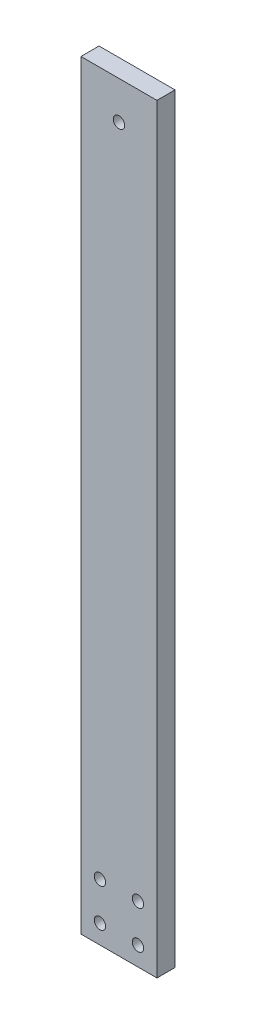
ISO-10303-21;
HEADER;
FILE_DESCRIPTION(('STEP AP214'),'2;1');
FILE_NAME('part.step','',(''),(''),'','','');
FILE_SCHEMA(('AUTOMOTIVE_DESIGN { 1 0 10303 214 1 1 1 1 }'));
ENDSEC;
DATA;
#1=APPLICATION_CONTEXT('core data for automotive mechanical design processes');
#2=APPLICATION_PROTOCOL_DEFINITION('international standard','automotive_design',2000,#1);
#3=PRODUCT_CONTEXT('',#1,'mechanical');
#4=PRODUCT('Part','Part','',(#3));
#5=PRODUCT_RELATED_PRODUCT_CATEGORY('part','',(#4));
#6=PRODUCT_DEFINITION_FORMATION('','',#4);
#7=PRODUCT_DEFINITION_CONTEXT('part definition',#1,'design');
#8=PRODUCT_DEFINITION('design','',#6,#7);
#9=PRODUCT_DEFINITION_SHAPE('','',#8);
#10=(LENGTH_UNIT() NAMED_UNIT(*) SI_UNIT(.MILLI.,.METRE.));
#11=(NAMED_UNIT(*) PLANE_ANGLE_UNIT() SI_UNIT($,.RADIAN.));
#12=(NAMED_UNIT(*) SI_UNIT($,.STERADIAN.) SOLID_ANGLE_UNIT());
#13=UNCERTAINTY_MEASURE_WITH_UNIT(LENGTH_MEASURE(1.E-05),#10,'distance_accuracy_value','');
#14=(GEOMETRIC_REPRESENTATION_CONTEXT(3) GLOBAL_UNCERTAINTY_ASSIGNED_CONTEXT((#13)) GLOBAL_UNIT_ASSIGNED_CONTEXT((#10,
#11,#12)) REPRESENTATION_CONTEXT('',''));
#15=CARTESIAN_POINT('',(0.,0.,0.));
#16=DIRECTION('',(0.,0.,1.));
#17=DIRECTION('',(1.,0.,0.));
#18=AXIS2_PLACEMENT_3D('',#15,#16,#17);
#19=CARTESIAN_POINT('',(10.,-100.,4.7625));
#20=DIRECTION('',(-1.,0.,0.));
#21=DIRECTION('',(0.,0.,1.));
#22=AXIS2_PLACEMENT_3D('',#19,#20,#21);
#23=PLANE('',#22);
#24=DIRECTION('',(0.,1.,0.));
#25=VECTOR('',#24,1.);
#26=CARTESIAN_POINT('',(10.,-100.,0.));
#27=LINE('',#26,#25);
#28=CARTESIAN_POINT('',(10.,-100.,0.));
#29=VERTEX_POINT('',#28);
#30=CARTESIAN_POINT('',(10.,100.,0.));
#31=VERTEX_POINT('',#30);
#32=EDGE_CURVE('E97',#29,#31,#27,.T.);
#33=ORIENTED_EDGE('',*,*,#32,.T.);
#34=DIRECTION('',(0.,0.,-1.));
#35=VECTOR('',#34,1.);
#36=CARTESIAN_POINT('',(10.,100.,4.7625));
#37=LINE('',#36,#35);
#38=CARTESIAN_POINT('',(10.,100.,4.7625));
#39=VERTEX_POINT('',#38);
#40=EDGE_CURVE('E11',#39,#31,#37,.T.);
#41=ORIENTED_EDGE('',*,*,#40,.F.);
#42=DIRECTION('',(0.,1.,0.));
#43=VECTOR('',#42,1.);
#44=CARTESIAN_POINT('',(10.,-100.,4.7625));
#45=LINE('',#44,#43);
#46=CARTESIAN_POINT('',(10.,-100.,4.7625));
#47=VERTEX_POINT('',#46);
#48=EDGE_CURVE('E85',#47,#39,#45,.T.);
#49=ORIENTED_EDGE('',*,*,#48,.F.);
#50=DIRECTION('',(0.,0.,-1.));
#51=VECTOR('',#50,1.);
#52=CARTESIAN_POINT('',(10.,-100.,4.7625));
#53=LINE('',#52,#51);
#54=EDGE_CURVE('E93',#47,#29,#53,.T.);
#55=ORIENTED_EDGE('',*,*,#54,.T.);
#56=EDGE_LOOP('',(#33,#41,#49,#55));
#57=FACE_BOUND('',#56,.T.);
#58=ADVANCED_FACE('F34',(#57),#23,.F.);
#59=CARTESIAN_POINT('',(-10.,100.,4.7625));
#60=DIRECTION('',(0.,-1.,0.));
#61=DIRECTION('',(0.,0.,-1.));
#62=AXIS2_PLACEMENT_3D('',#59,#60,#61);
#63=PLANE('',#62);
#64=DIRECTION('',(-1.,0.,0.));
#65=VECTOR('',#64,1.);
#66=CARTESIAN_POINT('',(-10.,100.,0.));
#67=LINE('',#66,#65);
#68=CARTESIAN_POINT('',(-10.,100.,0.));
#69=VERTEX_POINT('',#68);
#70=EDGE_CURVE('E89',#31,#69,#67,.T.);
#71=ORIENTED_EDGE('',*,*,#70,.T.);
#72=DIRECTION('',(0.,0.,-1.));
#73=VECTOR('',#72,1.);
#74=CARTESIAN_POINT('',(-10.,100.,4.7625));
#75=LINE('',#74,#73);
#76=CARTESIAN_POINT('',(-10.,100.,4.7625));
#77=VERTEX_POINT('',#76);
#78=EDGE_CURVE('E42',#77,#69,#75,.T.);
#79=ORIENTED_EDGE('',*,*,#78,.F.);
#80=DIRECTION('',(-1.,0.,0.));
#81=VECTOR('',#80,1.);
#82=CARTESIAN_POINT('',(-10.,100.,4.7625));
#83=LINE('',#82,#81);
#84=EDGE_CURVE('E80',#39,#77,#83,.T.);
#85=ORIENTED_EDGE('',*,*,#84,.F.);
#86=ORIENTED_EDGE('',*,*,#40,.T.);
#87=EDGE_LOOP('',(#71,#79,#85,#86));
#88=FACE_BOUND('',#87,.T.);
#89=ADVANCED_FACE('F88',(#88),#63,.F.);
#90=CARTESIAN_POINT('',(-10.,-100.,4.7625));
#91=DIRECTION('',(1.,0.,0.));
#92=DIRECTION('',(0.,0.,-1.));
#93=AXIS2_PLACEMENT_3D('',#90,#91,#92);
#94=PLANE('',#93);
#95=DIRECTION('',(0.,-1.,0.));
#96=VECTOR('',#95,1.);
#97=CARTESIAN_POINT('',(-10.,-100.,0.));
#98=LINE('',#97,#96);
#99=CARTESIAN_POINT('',(-10.,-100.,0.));
#100=VERTEX_POINT('',#99);
#101=EDGE_CURVE('E67',#69,#100,#98,.T.);
#102=ORIENTED_EDGE('',*,*,#101,.T.);
#103=DIRECTION('',(0.,0.,-1.));
#104=VECTOR('',#103,1.);
#105=CARTESIAN_POINT('',(-10.,-100.,4.7625));
#106=LINE('',#105,#104);
#107=CARTESIAN_POINT('',(-10.,-100.,4.7625));
#108=VERTEX_POINT('',#107);
#109=EDGE_CURVE('E90',#108,#100,#106,.T.);
#110=ORIENTED_EDGE('',*,*,#109,.F.);
#111=DIRECTION('',(0.,-1.,0.));
#112=VECTOR('',#111,1.);
#113=CARTESIAN_POINT('',(-10.,-100.,4.7625));
#114=LINE('',#113,#112);
#115=EDGE_CURVE('E83',#77,#108,#114,.T.);
#116=ORIENTED_EDGE('',*,*,#115,.F.);
#117=ORIENTED_EDGE('',*,*,#78,.T.);
#118=EDGE_LOOP('',(#102,#110,#116,#117));
#119=FACE_BOUND('',#118,.T.);
#120=ADVANCED_FACE('F91',(#119),#94,.F.);
#121=CARTESIAN_POINT('',(-10.,-100.,4.7625));
#122=DIRECTION('',(0.,1.,0.));
#123=DIRECTION('',(0.,0.,1.));
#124=AXIS2_PLACEMENT_3D('',#121,#122,#123);
#125=PLANE('',#124);
#126=DIRECTION('',(1.,0.,0.));
#127=VECTOR('',#126,1.);
#128=CARTESIAN_POINT('',(-10.,-100.,0.));
#129=LINE('',#128,#127);
#130=EDGE_CURVE('E73',#100,#29,#129,.T.);
#131=ORIENTED_EDGE('',*,*,#130,.T.);
#132=ORIENTED_EDGE('',*,*,#54,.F.);
#133=DIRECTION('',(1.,0.,0.));
#134=VECTOR('',#133,1.);
#135=CARTESIAN_POINT('',(-10.,-100.,4.7625));
#136=LINE('',#135,#134);
#137=EDGE_CURVE('E50',#108,#47,#136,.T.);
#138=ORIENTED_EDGE('',*,*,#137,.F.);
#139=ORIENTED_EDGE('',*,*,#109,.T.);
#140=EDGE_LOOP('',(#131,#132,#138,#139));
#141=FACE_BOUND('',#140,.T.);
#142=ADVANCED_FACE('F105',(#141),#125,.F.);
#143=CARTESIAN_POINT('',(0.,0.,4.7625));
#144=DIRECTION('',(0.,0.,-1.));
#145=DIRECTION('',(-1.,0.,0.));
#146=AXIS2_PLACEMENT_3D('',#143,#144,#145);
#147=PLANE('',#146);
#148=CARTESIAN_POINT('',(0.,90.,4.7625));
#149=DIRECTION('',(0.,0.,1.));
#150=DIRECTION('',(1.,0.,0.));
#151=AXIS2_PLACEMENT_3D('',#148,#149,#150);
#152=CIRCLE('',#151,1.5);
#153=CARTESIAN_POINT('',(1.5,90.,4.7625));
#154=VERTEX_POINT('',#153);
#155=EDGE_CURVE('E135',#154,#154,#152,.T.);
#156=ORIENTED_EDGE('',*,*,#155,.F.);
#157=EDGE_LOOP('',(#156));
#158=FACE_BOUND('',#157,.T.);
#159=CARTESIAN_POINT('',(5.,-95.,4.7625));
#160=DIRECTION('',(0.,0.,1.));
#161=DIRECTION('',(1.,0.,0.));
#162=AXIS2_PLACEMENT_3D('',#159,#160,#161);
#163=CIRCLE('',#162,1.5);
#164=CARTESIAN_POINT('',(6.5,-95.,4.7625));
#165=VERTEX_POINT('',#164);
#166=EDGE_CURVE('E124',#165,#165,#163,.T.);
#167=ORIENTED_EDGE('',*,*,#166,.F.);
#168=EDGE_LOOP('',(#167));
#169=FACE_BOUND('',#168,.T.);
#170=CARTESIAN_POINT('',(-5.,-85.,4.7625));
#171=DIRECTION('',(0.,0.,1.));
#172=DIRECTION('',(1.,0.,0.));
#173=AXIS2_PLACEMENT_3D('',#170,#171,#172);
#174=CIRCLE('',#173,1.5);
#175=CARTESIAN_POINT('',(-3.5,-85.,4.7625));
#176=VERTEX_POINT('',#175);
#177=EDGE_CURVE('E117',#176,#176,#174,.T.);
#178=ORIENTED_EDGE('',*,*,#177,.F.);
#179=EDGE_LOOP('',(#178));
#180=FACE_BOUND('',#179,.T.);
#181=CARTESIAN_POINT('',(5.,-85.,4.7625));
#182=DIRECTION('',(0.,0.,1.));
#183=DIRECTION('',(1.,0.,0.));
#184=AXIS2_PLACEMENT_3D('',#181,#182,#183);
#185=CIRCLE('',#184,1.5);
#186=CARTESIAN_POINT('',(6.5,-85.,4.7625));
#187=VERTEX_POINT('',#186);
#188=EDGE_CURVE('E129',#187,#187,#185,.T.);
#189=ORIENTED_EDGE('',*,*,#188,.F.);
#190=EDGE_LOOP('',(#189));
#191=FACE_BOUND('',#190,.T.);
#192=CARTESIAN_POINT('',(-5.,-95.,4.7625));
#193=DIRECTION('',(0.,0.,1.));
#194=DIRECTION('',(1.,0.,0.));
#195=AXIS2_PLACEMENT_3D('',#192,#193,#194);
#196=CIRCLE('',#195,1.5);
#197=CARTESIAN_POINT('',(-3.5,-95.,4.7625));
#198=VERTEX_POINT('',#197);
#199=EDGE_CURVE('E111',#198,#198,#196,.T.);
#200=ORIENTED_EDGE('',*,*,#199,.F.);
#201=EDGE_LOOP('',(#200));
#202=FACE_BOUND('',#201,.T.);
#203=ORIENTED_EDGE('',*,*,#48,.T.);
#204=ORIENTED_EDGE('',*,*,#84,.T.);
#205=ORIENTED_EDGE('',*,*,#115,.T.);
#206=ORIENTED_EDGE('',*,*,#137,.T.);
#207=EDGE_LOOP('',(#203,#204,#205,#206));
#208=FACE_BOUND('',#207,.T.);
#209=ADVANCED_FACE('F81',(#158,#169,#180,#191,#202,#208),#147,.F.);
#210=CARTESIAN_POINT('',(0.,0.,0.));
#211=DIRECTION('',(0.,0.,-1.));
#212=DIRECTION('',(-1.,0.,0.));
#213=AXIS2_PLACEMENT_3D('',#210,#211,#212);
#214=PLANE('',#213);
#215=CARTESIAN_POINT('',(0.,90.,0.));
#216=DIRECTION('',(0.,0.,1.));
#217=DIRECTION('',(1.,0.,0.));
#218=AXIS2_PLACEMENT_3D('',#215,#216,#217);
#219=CIRCLE('',#218,1.5);
#220=CARTESIAN_POINT('',(1.5,90.,0.));
#221=VERTEX_POINT('',#220);
#222=EDGE_CURVE('E132',#221,#221,#219,.T.);
#223=ORIENTED_EDGE('',*,*,#222,.T.);
#224=EDGE_LOOP('',(#223));
#225=FACE_BOUND('',#224,.T.);
#226=CARTESIAN_POINT('',(5.,-95.,0.));
#227=DIRECTION('',(0.,0.,1.));
#228=DIRECTION('',(1.,0.,0.));
#229=AXIS2_PLACEMENT_3D('',#226,#227,#228);
#230=CIRCLE('',#229,1.5);
#231=CARTESIAN_POINT('',(6.5,-95.,0.));
#232=VERTEX_POINT('',#231);
#233=EDGE_CURVE('E114',#232,#232,#230,.T.);
#234=ORIENTED_EDGE('',*,*,#233,.T.);
#235=EDGE_LOOP('',(#234));
#236=FACE_BOUND('',#235,.T.);
#237=CARTESIAN_POINT('',(-5.,-85.,0.));
#238=DIRECTION('',(0.,0.,1.));
#239=DIRECTION('',(1.,0.,0.));
#240=AXIS2_PLACEMENT_3D('',#237,#238,#239);
#241=CIRCLE('',#240,1.5);
#242=CARTESIAN_POINT('',(-3.5,-85.,0.));
#243=VERTEX_POINT('',#242);
#244=EDGE_CURVE('E120',#243,#243,#241,.T.);
#245=ORIENTED_EDGE('',*,*,#244,.T.);
#246=EDGE_LOOP('',(#245));
#247=FACE_BOUND('',#246,.T.);
#248=CARTESIAN_POINT('',(5.,-85.,0.));
#249=DIRECTION('',(0.,0.,1.));
#250=DIRECTION('',(1.,0.,0.));
#251=AXIS2_PLACEMENT_3D('',#248,#249,#250);
#252=CIRCLE('',#251,1.5);
#253=CARTESIAN_POINT('',(6.5,-85.,0.));
#254=VERTEX_POINT('',#253);
#255=EDGE_CURVE('E121',#254,#254,#252,.T.);
#256=ORIENTED_EDGE('',*,*,#255,.T.);
#257=EDGE_LOOP('',(#256));
#258=FACE_BOUND('',#257,.T.);
#259=CARTESIAN_POINT('',(-5.,-95.,0.));
#260=DIRECTION('',(0.,0.,1.));
#261=DIRECTION('',(1.,0.,0.));
#262=AXIS2_PLACEMENT_3D('',#259,#260,#261);
#263=CIRCLE('',#262,1.5);
#264=CARTESIAN_POINT('',(-3.5,-95.,0.));
#265=VERTEX_POINT('',#264);
#266=EDGE_CURVE('E100',#265,#265,#263,.T.);
#267=ORIENTED_EDGE('',*,*,#266,.T.);
#268=EDGE_LOOP('',(#267));
#269=FACE_BOUND('',#268,.T.);
#270=ORIENTED_EDGE('',*,*,#32,.F.);
#271=ORIENTED_EDGE('',*,*,#130,.F.);
#272=ORIENTED_EDGE('',*,*,#101,.F.);
#273=ORIENTED_EDGE('',*,*,#70,.F.);
#274=EDGE_LOOP('',(#270,#271,#272,#273));
#275=FACE_BOUND('',#274,.T.);
#276=ADVANCED_FACE('F108',(#225,#236,#247,#258,#269,#275),#214,.T.);
#277=CARTESIAN_POINT('',(-5.,-95.,0.));
#278=DIRECTION('',(0.,0.,1.));
#279=DIRECTION('',(1.,0.,0.));
#280=AXIS2_PLACEMENT_3D('',#277,#278,#279);
#281=CYLINDRICAL_SURFACE('',#280,1.5);
#282=CARTESIAN_POINT('',(-3.5,-95.,0.));
#283=CARTESIAN_POINT('',(-3.5,-95.,0.049609375));
#284=CARTESIAN_POINT('',(-3.5,-95.,0.09921875));
#285=CARTESIAN_POINT('',(-3.5,-95.,0.1984375));
#286=CARTESIAN_POINT('',(-3.5,-95.,0.248046875));
#287=CARTESIAN_POINT('',(-3.5,-95.,0.347265625));
#288=CARTESIAN_POINT('',(-3.5,-95.,0.396875));
#289=CARTESIAN_POINT('',(-3.5,-95.,0.49609375));
#290=CARTESIAN_POINT('',(-3.5,-95.,0.545703125));
#291=CARTESIAN_POINT('',(-3.5,-95.,0.644921875));
#292=CARTESIAN_POINT('',(-3.5,-95.,0.69453125));
#293=CARTESIAN_POINT('',(-3.5,-95.,0.79375));
#294=CARTESIAN_POINT('',(-3.5,-95.,0.843359375));
#295=CARTESIAN_POINT('',(-3.5,-95.,0.942578125));
#296=CARTESIAN_POINT('',(-3.5,-95.,0.9921875));
#297=CARTESIAN_POINT('',(-3.5,-95.,1.09140625));
#298=CARTESIAN_POINT('',(-3.5,-95.,1.141015625));
#299=CARTESIAN_POINT('',(-3.5,-95.,1.240234375));
#300=CARTESIAN_POINT('',(-3.5,-95.,1.28984375));
#301=CARTESIAN_POINT('',(-3.5,-95.,1.3890625));
#302=CARTESIAN_POINT('',(-3.5,-95.,1.438671875));
#303=CARTESIAN_POINT('',(-3.5,-95.,1.537890625));
#304=CARTESIAN_POINT('',(-3.5,-95.,1.5875));
#305=CARTESIAN_POINT('',(-3.5,-95.,1.68671875));
#306=CARTESIAN_POINT('',(-3.5,-95.,1.736328125));
#307=CARTESIAN_POINT('',(-3.5,-95.,1.835546875));
#308=CARTESIAN_POINT('',(-3.5,-95.,1.88515625));
#309=CARTESIAN_POINT('',(-3.5,-95.,1.984375));
#310=CARTESIAN_POINT('',(-3.5,-95.,2.033984375));
#311=CARTESIAN_POINT('',(-3.5,-95.,2.133203125));
#312=CARTESIAN_POINT('',(-3.5,-95.,2.1828125));
#313=CARTESIAN_POINT('',(-3.5,-95.,2.28203125));
#314=CARTESIAN_POINT('',(-3.5,-95.,2.331640625));
#315=CARTESIAN_POINT('',(-3.5,-95.,2.430859375));
#316=CARTESIAN_POINT('',(-3.5,-95.,2.48046875));
#317=CARTESIAN_POINT('',(-3.5,-95.,2.5796875));
#318=CARTESIAN_POINT('',(-3.5,-95.,2.629296875));
#319=CARTESIAN_POINT('',(-3.5,-95.,2.728515625));
#320=CARTESIAN_POINT('',(-3.5,-95.,2.778125));
#321=CARTESIAN_POINT('',(-3.5,-95.,2.87734375));
#322=CARTESIAN_POINT('',(-3.5,-95.,2.926953125));
#323=CARTESIAN_POINT('',(-3.5,-95.,3.026171875));
#324=CARTESIAN_POINT('',(-3.5,-95.,3.07578125));
#325=CARTESIAN_POINT('',(-3.5,-95.,3.175));
#326=CARTESIAN_POINT('',(-3.5,-95.,3.224609375));
#327=CARTESIAN_POINT('',(-3.5,-95.,3.323828125));
#328=CARTESIAN_POINT('',(-3.5,-95.,3.3734375));
#329=CARTESIAN_POINT('',(-3.5,-95.,3.47265625));
#330=CARTESIAN_POINT('',(-3.5,-95.,3.522265625));
#331=CARTESIAN_POINT('',(-3.5,-95.,3.621484375));
#332=CARTESIAN_POINT('',(-3.5,-95.,3.67109375));
#333=CARTESIAN_POINT('',(-3.5,-95.,3.7703125));
#334=CARTESIAN_POINT('',(-3.5,-95.,3.819921875));
#335=CARTESIAN_POINT('',(-3.5,-95.,3.919140625));
#336=CARTESIAN_POINT('',(-3.5,-95.,3.96875));
#337=CARTESIAN_POINT('',(-3.5,-95.,4.06796875));
#338=CARTESIAN_POINT('',(-3.5,-95.,4.117578125));
#339=CARTESIAN_POINT('',(-3.5,-95.,4.216796875));
#340=CARTESIAN_POINT('',(-3.5,-95.,4.26640625));
#341=CARTESIAN_POINT('',(-3.5,-95.,4.365625));
#342=CARTESIAN_POINT('',(-3.5,-95.,4.415234375));
#343=CARTESIAN_POINT('',(-3.5,-95.,4.514453125));
#344=CARTESIAN_POINT('',(-3.5,-95.,4.5640625));
#345=CARTESIAN_POINT('',(-3.5,-95.,4.66328125));
#346=CARTESIAN_POINT('',(-3.5,-95.,4.712890625));
#347=CARTESIAN_POINT('',(-3.5,-95.,4.7625));
#348=B_SPLINE_CURVE_WITH_KNOTS('',3,(#282,#283,#284,#285,#286,#287,#288,#289,#290,#291,#292,
#293,#294,#295,#296,#297,#298,#299,#300,#301,#302,#303,#304,#305,#306,#307,#308,#309,#310,#311,
#312,#313,#314,#315,#316,#317,#318,#319,#320,#321,#322,#323,#324,#325,#326,#327,#328,#329,#330,
#331,#332,#333,#334,#335,#336,#337,#338,#339,#340,#341,#342,#343,#344,#345,#346,#347),
.UNSPECIFIED.,.F.,.F.,(4,2,2,2,2,2,2,2,2,2,2,2,2,2,2,2,2,2,2,2,2,2,2,2,2,2,2,2,2,2,2,2,4),(0.,
0.148828125,0.29765625,0.446484375,0.5953125,0.744140625,0.89296875,1.041796875,1.190625,
1.339453125,1.48828125,1.637109375,1.7859375,1.934765625,2.08359375,2.232421875,2.38125,
2.530078125,2.67890625,2.827734375,2.9765625,3.125390625,3.27421875,3.423046875,3.571875,
3.720703125,3.86953125,4.018359375,4.1671875,4.316015625,4.46484375,4.613671875,4.7625),.UNSPECIFIED.);
#349=EDGE_CURVE('BSEAM161',#265,#198,#348,.T.);
#350=ORIENTED_EDGE('',*,*,#266,.F.);
#351=ORIENTED_EDGE('',*,*,#199,.T.);
#352=ORIENTED_EDGE('',*,*,#349,.T.);
#353=ORIENTED_EDGE('',*,*,#349,.F.);
#354=EDGE_LOOP('',(#350,#352,#351,#353));
#355=FACE_BOUND('',#354,.T.);
#356=ADVANCED_FACE('F161',(#355),#281,.F.);
#357=CARTESIAN_POINT('',(5.,-85.,0.));
#358=DIRECTION('',(0.,0.,1.));
#359=DIRECTION('',(1.,0.,0.));
#360=AXIS2_PLACEMENT_3D('',#357,#358,#359);
#361=CYLINDRICAL_SURFACE('',#360,1.5);
#362=CARTESIAN_POINT('',(6.5,-85.,0.));
#363=CARTESIAN_POINT('',(6.5,-85.,0.049609375));
#364=CARTESIAN_POINT('',(6.5,-85.,0.09921875));
#365=CARTESIAN_POINT('',(6.5,-85.,0.1984375));
#366=CARTESIAN_POINT('',(6.5,-85.,0.248046875));
#367=CARTESIAN_POINT('',(6.5,-85.,0.347265625));
#368=CARTESIAN_POINT('',(6.5,-85.,0.396875));
#369=CARTESIAN_POINT('',(6.5,-85.,0.49609375));
#370=CARTESIAN_POINT('',(6.5,-85.,0.545703125));
#371=CARTESIAN_POINT('',(6.5,-85.,0.644921875));
#372=CARTESIAN_POINT('',(6.5,-85.,0.69453125));
#373=CARTESIAN_POINT('',(6.5,-85.,0.79375));
#374=CARTESIAN_POINT('',(6.5,-85.,0.843359375));
#375=CARTESIAN_POINT('',(6.5,-85.,0.942578125));
#376=CARTESIAN_POINT('',(6.5,-85.,0.9921875));
#377=CARTESIAN_POINT('',(6.5,-85.,1.09140625));
#378=CARTESIAN_POINT('',(6.5,-85.,1.141015625));
#379=CARTESIAN_POINT('',(6.5,-85.,1.240234375));
#380=CARTESIAN_POINT('',(6.5,-85.,1.28984375));
#381=CARTESIAN_POINT('',(6.5,-85.,1.3890625));
#382=CARTESIAN_POINT('',(6.5,-85.,1.438671875));
#383=CARTESIAN_POINT('',(6.5,-85.,1.537890625));
#384=CARTESIAN_POINT('',(6.5,-85.,1.5875));
#385=CARTESIAN_POINT('',(6.5,-85.,1.68671875));
#386=CARTESIAN_POINT('',(6.5,-85.,1.736328125));
#387=CARTESIAN_POINT('',(6.5,-85.,1.835546875));
#388=CARTESIAN_POINT('',(6.5,-85.,1.88515625));
#389=CARTESIAN_POINT('',(6.5,-85.,1.984375));
#390=CARTESIAN_POINT('',(6.5,-85.,2.033984375));
#391=CARTESIAN_POINT('',(6.5,-85.,2.133203125));
#392=CARTESIAN_POINT('',(6.5,-85.,2.1828125));
#393=CARTESIAN_POINT('',(6.5,-85.,2.28203125));
#394=CARTESIAN_POINT('',(6.5,-85.,2.331640625));
#395=CARTESIAN_POINT('',(6.5,-85.,2.430859375));
#396=CARTESIAN_POINT('',(6.5,-85.,2.48046875));
#397=CARTESIAN_POINT('',(6.5,-85.,2.5796875));
#398=CARTESIAN_POINT('',(6.5,-85.,2.629296875));
#399=CARTESIAN_POINT('',(6.5,-85.,2.728515625));
#400=CARTESIAN_POINT('',(6.5,-85.,2.778125));
#401=CARTESIAN_POINT('',(6.5,-85.,2.87734375));
#402=CARTESIAN_POINT('',(6.5,-85.,2.926953125));
#403=CARTESIAN_POINT('',(6.5,-85.,3.026171875));
#404=CARTESIAN_POINT('',(6.5,-85.,3.07578125));
#405=CARTESIAN_POINT('',(6.5,-85.,3.175));
#406=CARTESIAN_POINT('',(6.5,-85.,3.224609375));
#407=CARTESIAN_POINT('',(6.5,-85.,3.323828125));
#408=CARTESIAN_POINT('',(6.5,-85.,3.3734375));
#409=CARTESIAN_POINT('',(6.5,-85.,3.47265625));
#410=CARTESIAN_POINT('',(6.5,-85.,3.522265625));
#411=CARTESIAN_POINT('',(6.5,-85.,3.621484375));
#412=CARTESIAN_POINT('',(6.5,-85.,3.67109375));
#413=CARTESIAN_POINT('',(6.5,-85.,3.7703125));
#414=CARTESIAN_POINT('',(6.5,-85.,3.819921875));
#415=CARTESIAN_POINT('',(6.5,-85.,3.919140625));
#416=CARTESIAN_POINT('',(6.5,-85.,3.96875));
#417=CARTESIAN_POINT('',(6.5,-85.,4.06796875));
#418=CARTESIAN_POINT('',(6.5,-85.,4.117578125));
#419=CARTESIAN_POINT('',(6.5,-85.,4.216796875));
#420=CARTESIAN_POINT('',(6.5,-85.,4.26640625));
#421=CARTESIAN_POINT('',(6.5,-85.,4.365625));
#422=CARTESIAN_POINT('',(6.5,-85.,4.415234375));
#423=CARTESIAN_POINT('',(6.5,-85.,4.514453125));
#424=CARTESIAN_POINT('',(6.5,-85.,4.5640625));
#425=CARTESIAN_POINT('',(6.5,-85.,4.66328125));
#426=CARTESIAN_POINT('',(6.5,-85.,4.712890625));
#427=CARTESIAN_POINT('',(6.5,-85.,4.7625));
#428=B_SPLINE_CURVE_WITH_KNOTS('',3,(#362,#363,#364,#365,#366,#367,#368,#369,#370,#371,#372,
#373,#374,#375,#376,#377,#378,#379,#380,#381,#382,#383,#384,#385,#386,#387,#388,#389,#390,#391,
#392,#393,#394,#395,#396,#397,#398,#399,#400,#401,#402,#403,#404,#405,#406,#407,#408,#409,#410,
#411,#412,#413,#414,#415,#416,#417,#418,#419,#420,#421,#422,#423,#424,#425,#426,#427),
.UNSPECIFIED.,.F.,.F.,(4,2,2,2,2,2,2,2,2,2,2,2,2,2,2,2,2,2,2,2,2,2,2,2,2,2,2,2,2,2,2,2,4),(0.,
0.148828125,0.29765625,0.446484375,0.5953125,0.744140625,0.89296875,1.041796875,1.190625,
1.339453125,1.48828125,1.637109375,1.7859375,1.934765625,2.08359375,2.232421875,2.38125,
2.530078125,2.67890625,2.827734375,2.9765625,3.125390625,3.27421875,3.423046875,3.571875,
3.720703125,3.86953125,4.018359375,4.1671875,4.316015625,4.46484375,4.613671875,4.7625),.UNSPECIFIED.);
#429=EDGE_CURVE('BSEAM163',#254,#187,#428,.T.);
#430=ORIENTED_EDGE('',*,*,#255,.F.);
#431=ORIENTED_EDGE('',*,*,#188,.T.);
#432=ORIENTED_EDGE('',*,*,#429,.T.);
#433=ORIENTED_EDGE('',*,*,#429,.F.);
#434=EDGE_LOOP('',(#430,#432,#431,#433));
#435=FACE_BOUND('',#434,.T.);
#436=ADVANCED_FACE('F163',(#435),#361,.F.);
#437=CARTESIAN_POINT('',(-5.,-85.,0.));
#438=DIRECTION('',(0.,0.,1.));
#439=DIRECTION('',(1.,0.,0.));
#440=AXIS2_PLACEMENT_3D('',#437,#438,#439);
#441=CYLINDRICAL_SURFACE('',#440,1.5);
#442=CARTESIAN_POINT('',(-3.5,-85.,0.));
#443=CARTESIAN_POINT('',(-3.5,-85.,0.049609375));
#444=CARTESIAN_POINT('',(-3.5,-85.,0.09921875));
#445=CARTESIAN_POINT('',(-3.5,-85.,0.1984375));
#446=CARTESIAN_POINT('',(-3.5,-85.,0.248046875));
#447=CARTESIAN_POINT('',(-3.5,-85.,0.347265625));
#448=CARTESIAN_POINT('',(-3.5,-85.,0.396875));
#449=CARTESIAN_POINT('',(-3.5,-85.,0.49609375));
#450=CARTESIAN_POINT('',(-3.5,-85.,0.545703125));
#451=CARTESIAN_POINT('',(-3.5,-85.,0.644921875));
#452=CARTESIAN_POINT('',(-3.5,-85.,0.69453125));
#453=CARTESIAN_POINT('',(-3.5,-85.,0.79375));
#454=CARTESIAN_POINT('',(-3.5,-85.,0.843359375));
#455=CARTESIAN_POINT('',(-3.5,-85.,0.942578125));
#456=CARTESIAN_POINT('',(-3.5,-85.,0.9921875));
#457=CARTESIAN_POINT('',(-3.5,-85.,1.09140625));
#458=CARTESIAN_POINT('',(-3.5,-85.,1.141015625));
#459=CARTESIAN_POINT('',(-3.5,-85.,1.240234375));
#460=CARTESIAN_POINT('',(-3.5,-85.,1.28984375));
#461=CARTESIAN_POINT('',(-3.5,-85.,1.3890625));
#462=CARTESIAN_POINT('',(-3.5,-85.,1.438671875));
#463=CARTESIAN_POINT('',(-3.5,-85.,1.537890625));
#464=CARTESIAN_POINT('',(-3.5,-85.,1.5875));
#465=CARTESIAN_POINT('',(-3.5,-85.,1.68671875));
#466=CARTESIAN_POINT('',(-3.5,-85.,1.736328125));
#467=CARTESIAN_POINT('',(-3.5,-85.,1.835546875));
#468=CARTESIAN_POINT('',(-3.5,-85.,1.88515625));
#469=CARTESIAN_POINT('',(-3.5,-85.,1.984375));
#470=CARTESIAN_POINT('',(-3.5,-85.,2.033984375));
#471=CARTESIAN_POINT('',(-3.5,-85.,2.133203125));
#472=CARTESIAN_POINT('',(-3.5,-85.,2.1828125));
#473=CARTESIAN_POINT('',(-3.5,-85.,2.28203125));
#474=CARTESIAN_POINT('',(-3.5,-85.,2.331640625));
#475=CARTESIAN_POINT('',(-3.5,-85.,2.430859375));
#476=CARTESIAN_POINT('',(-3.5,-85.,2.48046875));
#477=CARTESIAN_POINT('',(-3.5,-85.,2.5796875));
#478=CARTESIAN_POINT('',(-3.5,-85.,2.629296875));
#479=CARTESIAN_POINT('',(-3.5,-85.,2.728515625));
#480=CARTESIAN_POINT('',(-3.5,-85.,2.778125));
#481=CARTESIAN_POINT('',(-3.5,-85.,2.87734375));
#482=CARTESIAN_POINT('',(-3.5,-85.,2.926953125));
#483=CARTESIAN_POINT('',(-3.5,-85.,3.026171875));
#484=CARTESIAN_POINT('',(-3.5,-85.,3.07578125));
#485=CARTESIAN_POINT('',(-3.5,-85.,3.175));
#486=CARTESIAN_POINT('',(-3.5,-85.,3.224609375));
#487=CARTESIAN_POINT('',(-3.5,-85.,3.323828125));
#488=CARTESIAN_POINT('',(-3.5,-85.,3.3734375));
#489=CARTESIAN_POINT('',(-3.5,-85.,3.47265625));
#490=CARTESIAN_POINT('',(-3.5,-85.,3.522265625));
#491=CARTESIAN_POINT('',(-3.5,-85.,3.621484375));
#492=CARTESIAN_POINT('',(-3.5,-85.,3.67109375));
#493=CARTESIAN_POINT('',(-3.5,-85.,3.7703125));
#494=CARTESIAN_POINT('',(-3.5,-85.,3.819921875));
#495=CARTESIAN_POINT('',(-3.5,-85.,3.919140625));
#496=CARTESIAN_POINT('',(-3.5,-85.,3.96875));
#497=CARTESIAN_POINT('',(-3.5,-85.,4.06796875));
#498=CARTESIAN_POINT('',(-3.5,-85.,4.117578125));
#499=CARTESIAN_POINT('',(-3.5,-85.,4.216796875));
#500=CARTESIAN_POINT('',(-3.5,-85.,4.26640625));
#501=CARTESIAN_POINT('',(-3.5,-85.,4.365625));
#502=CARTESIAN_POINT('',(-3.5,-85.,4.415234375));
#503=CARTESIAN_POINT('',(-3.5,-85.,4.514453125));
#504=CARTESIAN_POINT('',(-3.5,-85.,4.5640625));
#505=CARTESIAN_POINT('',(-3.5,-85.,4.66328125));
#506=CARTESIAN_POINT('',(-3.5,-85.,4.712890625));
#507=CARTESIAN_POINT('',(-3.5,-85.,4.7625));
#508=B_SPLINE_CURVE_WITH_KNOTS('',3,(#442,#443,#444,#445,#446,#447,#448,#449,#450,#451,#452,
#453,#454,#455,#456,#457,#458,#459,#460,#461,#462,#463,#464,#465,#466,#467,#468,#469,#470,#471,
#472,#473,#474,#475,#476,#477,#478,#479,#480,#481,#482,#483,#484,#485,#486,#487,#488,#489,#490,
#491,#492,#493,#494,#495,#496,#497,#498,#499,#500,#501,#502,#503,#504,#505,#506,#507),
.UNSPECIFIED.,.F.,.F.,(4,2,2,2,2,2,2,2,2,2,2,2,2,2,2,2,2,2,2,2,2,2,2,2,2,2,2,2,2,2,2,2,4),(0.,
0.148828125,0.29765625,0.446484375,0.5953125,0.744140625,0.89296875,1.041796875,1.190625,
1.339453125,1.48828125,1.637109375,1.7859375,1.934765625,2.08359375,2.232421875,2.38125,
2.530078125,2.67890625,2.827734375,2.9765625,3.125390625,3.27421875,3.423046875,3.571875,
3.720703125,3.86953125,4.018359375,4.1671875,4.316015625,4.46484375,4.613671875,4.7625),.UNSPECIFIED.);
#509=EDGE_CURVE('BSEAM170',#243,#176,#508,.T.);
#510=ORIENTED_EDGE('',*,*,#244,.F.);
#511=ORIENTED_EDGE('',*,*,#177,.T.);
#512=ORIENTED_EDGE('',*,*,#509,.T.);
#513=ORIENTED_EDGE('',*,*,#509,.F.);
#514=EDGE_LOOP('',(#510,#512,#511,#513));
#515=FACE_BOUND('',#514,.T.);
#516=ADVANCED_FACE('F170',(#515),#441,.F.);
#517=CARTESIAN_POINT('',(5.,-95.,0.));
#518=DIRECTION('',(0.,0.,1.));
#519=DIRECTION('',(1.,0.,0.));
#520=AXIS2_PLACEMENT_3D('',#517,#518,#519);
#521=CYLINDRICAL_SURFACE('',#520,1.5);
#522=CARTESIAN_POINT('',(6.5,-95.,0.));
#523=CARTESIAN_POINT('',(6.5,-95.,0.049609375));
#524=CARTESIAN_POINT('',(6.5,-95.,0.09921875));
#525=CARTESIAN_POINT('',(6.5,-95.,0.1984375));
#526=CARTESIAN_POINT('',(6.5,-95.,0.248046875));
#527=CARTESIAN_POINT('',(6.5,-95.,0.347265625));
#528=CARTESIAN_POINT('',(6.5,-95.,0.396875));
#529=CARTESIAN_POINT('',(6.5,-95.,0.49609375));
#530=CARTESIAN_POINT('',(6.5,-95.,0.545703125));
#531=CARTESIAN_POINT('',(6.5,-95.,0.644921875));
#532=CARTESIAN_POINT('',(6.5,-95.,0.69453125));
#533=CARTESIAN_POINT('',(6.5,-95.,0.79375));
#534=CARTESIAN_POINT('',(6.5,-95.,0.843359375));
#535=CARTESIAN_POINT('',(6.5,-95.,0.942578125));
#536=CARTESIAN_POINT('',(6.5,-95.,0.9921875));
#537=CARTESIAN_POINT('',(6.5,-95.,1.09140625));
#538=CARTESIAN_POINT('',(6.5,-95.,1.141015625));
#539=CARTESIAN_POINT('',(6.5,-95.,1.240234375));
#540=CARTESIAN_POINT('',(6.5,-95.,1.28984375));
#541=CARTESIAN_POINT('',(6.5,-95.,1.3890625));
#542=CARTESIAN_POINT('',(6.5,-95.,1.438671875));
#543=CARTESIAN_POINT('',(6.5,-95.,1.537890625));
#544=CARTESIAN_POINT('',(6.5,-95.,1.5875));
#545=CARTESIAN_POINT('',(6.5,-95.,1.68671875));
#546=CARTESIAN_POINT('',(6.5,-95.,1.736328125));
#547=CARTESIAN_POINT('',(6.5,-95.,1.835546875));
#548=CARTESIAN_POINT('',(6.5,-95.,1.88515625));
#549=CARTESIAN_POINT('',(6.5,-95.,1.984375));
#550=CARTESIAN_POINT('',(6.5,-95.,2.033984375));
#551=CARTESIAN_POINT('',(6.5,-95.,2.133203125));
#552=CARTESIAN_POINT('',(6.5,-95.,2.1828125));
#553=CARTESIAN_POINT('',(6.5,-95.,2.28203125));
#554=CARTESIAN_POINT('',(6.5,-95.,2.331640625));
#555=CARTESIAN_POINT('',(6.5,-95.,2.430859375));
#556=CARTESIAN_POINT('',(6.5,-95.,2.48046875));
#557=CARTESIAN_POINT('',(6.5,-95.,2.5796875));
#558=CARTESIAN_POINT('',(6.5,-95.,2.629296875));
#559=CARTESIAN_POINT('',(6.5,-95.,2.728515625));
#560=CARTESIAN_POINT('',(6.5,-95.,2.778125));
#561=CARTESIAN_POINT('',(6.5,-95.,2.87734375));
#562=CARTESIAN_POINT('',(6.5,-95.,2.926953125));
#563=CARTESIAN_POINT('',(6.5,-95.,3.026171875));
#564=CARTESIAN_POINT('',(6.5,-95.,3.07578125));
#565=CARTESIAN_POINT('',(6.5,-95.,3.175));
#566=CARTESIAN_POINT('',(6.5,-95.,3.224609375));
#567=CARTESIAN_POINT('',(6.5,-95.,3.323828125));
#568=CARTESIAN_POINT('',(6.5,-95.,3.3734375));
#569=CARTESIAN_POINT('',(6.5,-95.,3.47265625));
#570=CARTESIAN_POINT('',(6.5,-95.,3.522265625));
#571=CARTESIAN_POINT('',(6.5,-95.,3.621484375));
#572=CARTESIAN_POINT('',(6.5,-95.,3.67109375));
#573=CARTESIAN_POINT('',(6.5,-95.,3.7703125));
#574=CARTESIAN_POINT('',(6.5,-95.,3.819921875));
#575=CARTESIAN_POINT('',(6.5,-95.,3.919140625));
#576=CARTESIAN_POINT('',(6.5,-95.,3.96875));
#577=CARTESIAN_POINT('',(6.5,-95.,4.06796875));
#578=CARTESIAN_POINT('',(6.5,-95.,4.117578125));
#579=CARTESIAN_POINT('',(6.5,-95.,4.216796875));
#580=CARTESIAN_POINT('',(6.5,-95.,4.26640625));
#581=CARTESIAN_POINT('',(6.5,-95.,4.365625));
#582=CARTESIAN_POINT('',(6.5,-95.,4.415234375));
#583=CARTESIAN_POINT('',(6.5,-95.,4.514453125));
#584=CARTESIAN_POINT('',(6.5,-95.,4.5640625));
#585=CARTESIAN_POINT('',(6.5,-95.,4.66328125));
#586=CARTESIAN_POINT('',(6.5,-95.,4.712890625));
#587=CARTESIAN_POINT('',(6.5,-95.,4.7625));
#588=B_SPLINE_CURVE_WITH_KNOTS('',3,(#522,#523,#524,#525,#526,#527,#528,#529,#530,#531,#532,
#533,#534,#535,#536,#537,#538,#539,#540,#541,#542,#543,#544,#545,#546,#547,#548,#549,#550,#551,
#552,#553,#554,#555,#556,#557,#558,#559,#560,#561,#562,#563,#564,#565,#566,#567,#568,#569,#570,
#571,#572,#573,#574,#575,#576,#577,#578,#579,#580,#581,#582,#583,#584,#585,#586,#587),
.UNSPECIFIED.,.F.,.F.,(4,2,2,2,2,2,2,2,2,2,2,2,2,2,2,2,2,2,2,2,2,2,2,2,2,2,2,2,2,2,2,2,4),(0.,
0.148828125,0.29765625,0.446484375,0.5953125,0.744140625,0.89296875,1.041796875,1.190625,
1.339453125,1.48828125,1.637109375,1.7859375,1.934765625,2.08359375,2.232421875,2.38125,
2.530078125,2.67890625,2.827734375,2.9765625,3.125390625,3.27421875,3.423046875,3.571875,
3.720703125,3.86953125,4.018359375,4.1671875,4.316015625,4.46484375,4.613671875,4.7625),.UNSPECIFIED.);
#589=EDGE_CURVE('BSEAM146',#232,#165,#588,.T.);
#590=ORIENTED_EDGE('',*,*,#233,.F.);
#591=ORIENTED_EDGE('',*,*,#166,.T.);
#592=ORIENTED_EDGE('',*,*,#589,.T.);
#593=ORIENTED_EDGE('',*,*,#589,.F.);
#594=EDGE_LOOP('',(#590,#592,#591,#593));
#595=FACE_BOUND('',#594,.T.);
#596=ADVANCED_FACE('F146',(#595),#521,.F.);
#597=CARTESIAN_POINT('',(0.,90.,0.));
#598=DIRECTION('',(0.,0.,1.));
#599=DIRECTION('',(1.,0.,0.));
#600=AXIS2_PLACEMENT_3D('',#597,#598,#599);
#601=CYLINDRICAL_SURFACE('',#600,1.5);
#602=CARTESIAN_POINT('',(1.5,90.,0.));
#603=CARTESIAN_POINT('',(1.5,90.,0.049609375));
#604=CARTESIAN_POINT('',(1.5,90.,0.09921875));
#605=CARTESIAN_POINT('',(1.5,90.,0.1984375));
#606=CARTESIAN_POINT('',(1.5,90.,0.248046875));
#607=CARTESIAN_POINT('',(1.5,90.,0.347265625));
#608=CARTESIAN_POINT('',(1.5,90.,0.396875));
#609=CARTESIAN_POINT('',(1.5,90.,0.49609375));
#610=CARTESIAN_POINT('',(1.5,90.,0.545703125));
#611=CARTESIAN_POINT('',(1.5,90.,0.644921875));
#612=CARTESIAN_POINT('',(1.5,90.,0.69453125));
#613=CARTESIAN_POINT('',(1.5,90.,0.79375));
#614=CARTESIAN_POINT('',(1.5,90.,0.843359375));
#615=CARTESIAN_POINT('',(1.5,90.,0.942578125));
#616=CARTESIAN_POINT('',(1.5,90.,0.9921875));
#617=CARTESIAN_POINT('',(1.5,90.,1.09140625));
#618=CARTESIAN_POINT('',(1.5,90.,1.141015625));
#619=CARTESIAN_POINT('',(1.5,90.,1.240234375));
#620=CARTESIAN_POINT('',(1.5,90.,1.28984375));
#621=CARTESIAN_POINT('',(1.5,90.,1.3890625));
#622=CARTESIAN_POINT('',(1.5,90.,1.438671875));
#623=CARTESIAN_POINT('',(1.5,90.,1.537890625));
#624=CARTESIAN_POINT('',(1.5,90.,1.5875));
#625=CARTESIAN_POINT('',(1.5,90.,1.68671875));
#626=CARTESIAN_POINT('',(1.5,90.,1.736328125));
#627=CARTESIAN_POINT('',(1.5,90.,1.835546875));
#628=CARTESIAN_POINT('',(1.5,90.,1.88515625));
#629=CARTESIAN_POINT('',(1.5,90.,1.984375));
#630=CARTESIAN_POINT('',(1.5,90.,2.033984375));
#631=CARTESIAN_POINT('',(1.5,90.,2.133203125));
#632=CARTESIAN_POINT('',(1.5,90.,2.1828125));
#633=CARTESIAN_POINT('',(1.5,90.,2.28203125));
#634=CARTESIAN_POINT('',(1.5,90.,2.331640625));
#635=CARTESIAN_POINT('',(1.5,90.,2.430859375));
#636=CARTESIAN_POINT('',(1.5,90.,2.48046875));
#637=CARTESIAN_POINT('',(1.5,90.,2.5796875));
#638=CARTESIAN_POINT('',(1.5,90.,2.629296875));
#639=CARTESIAN_POINT('',(1.5,90.,2.728515625));
#640=CARTESIAN_POINT('',(1.5,90.,2.778125));
#641=CARTESIAN_POINT('',(1.5,90.,2.87734375));
#642=CARTESIAN_POINT('',(1.5,90.,2.926953125));
#643=CARTESIAN_POINT('',(1.5,90.,3.026171875));
#644=CARTESIAN_POINT('',(1.5,90.,3.07578125));
#645=CARTESIAN_POINT('',(1.5,90.,3.175));
#646=CARTESIAN_POINT('',(1.5,90.,3.224609375));
#647=CARTESIAN_POINT('',(1.5,90.,3.323828125));
#648=CARTESIAN_POINT('',(1.5,90.,3.3734375));
#649=CARTESIAN_POINT('',(1.5,90.,3.47265625));
#650=CARTESIAN_POINT('',(1.5,90.,3.522265625));
#651=CARTESIAN_POINT('',(1.5,90.,3.621484375));
#652=CARTESIAN_POINT('',(1.5,90.,3.67109375));
#653=CARTESIAN_POINT('',(1.5,90.,3.7703125));
#654=CARTESIAN_POINT('',(1.5,90.,3.819921875));
#655=CARTESIAN_POINT('',(1.5,90.,3.919140625));
#656=CARTESIAN_POINT('',(1.5,90.,3.96875));
#657=CARTESIAN_POINT('',(1.5,90.,4.06796875));
#658=CARTESIAN_POINT('',(1.5,90.,4.117578125));
#659=CARTESIAN_POINT('',(1.5,90.,4.216796875));
#660=CARTESIAN_POINT('',(1.5,90.,4.26640625));
#661=CARTESIAN_POINT('',(1.5,90.,4.365625));
#662=CARTESIAN_POINT('',(1.5,90.,4.415234375));
#663=CARTESIAN_POINT('',(1.5,90.,4.514453125));
#664=CARTESIAN_POINT('',(1.5,90.,4.5640625));
#665=CARTESIAN_POINT('',(1.5,90.,4.66328125));
#666=CARTESIAN_POINT('',(1.5,90.,4.712890625));
#667=CARTESIAN_POINT('',(1.5,90.,4.7625));
#668=B_SPLINE_CURVE_WITH_KNOTS('',3,(#602,#603,#604,#605,#606,#607,#608,#609,#610,#611,#612,
#613,#614,#615,#616,#617,#618,#619,#620,#621,#622,#623,#624,#625,#626,#627,#628,#629,#630,#631,
#632,#633,#634,#635,#636,#637,#638,#639,#640,#641,#642,#643,#644,#645,#646,#647,#648,#649,#650,
#651,#652,#653,#654,#655,#656,#657,#658,#659,#660,#661,#662,#663,#664,#665,#666,#667),
.UNSPECIFIED.,.F.,.F.,(4,2,2,2,2,2,2,2,2,2,2,2,2,2,2,2,2,2,2,2,2,2,2,2,2,2,2,2,2,2,2,2,4),(0.,
0.148828125,0.29765625,0.446484375,0.5953125,0.744140625,0.89296875,1.041796875,1.190625,
1.339453125,1.48828125,1.637109375,1.7859375,1.934765625,2.08359375,2.232421875,2.38125,
2.530078125,2.67890625,2.827734375,2.9765625,3.125390625,3.27421875,3.423046875,3.571875,
3.720703125,3.86953125,4.018359375,4.1671875,4.316015625,4.46484375,4.613671875,4.7625),.UNSPECIFIED.);
#669=EDGE_CURVE('BSEAM143',#221,#154,#668,.T.);
#670=ORIENTED_EDGE('',*,*,#222,.F.);
#671=ORIENTED_EDGE('',*,*,#155,.T.);
#672=ORIENTED_EDGE('',*,*,#669,.T.);
#673=ORIENTED_EDGE('',*,*,#669,.F.);
#674=EDGE_LOOP('',(#670,#672,#671,#673));
#675=FACE_BOUND('',#674,.T.);
#676=ADVANCED_FACE('F143',(#675),#601,.F.);
#677=CLOSED_SHELL('',(#58,#89,#120,#142,#209,#276,#356,#436,#516,#596,#676));
#678=MANIFOLD_SOLID_BREP('B2',#677);
#679=ADVANCED_BREP_SHAPE_REPRESENTATION('',(#18,#678),#14);
#680=SHAPE_DEFINITION_REPRESENTATION(#9,#679);
ENDSEC;
END-ISO-10303-21;
